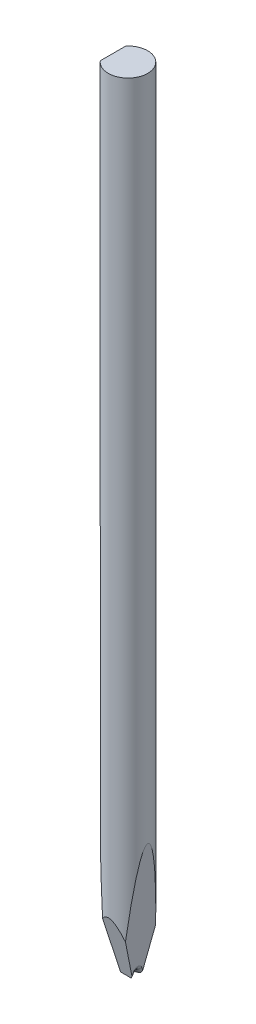
ISO-10303-21;
HEADER;
FILE_DESCRIPTION(('STEP AP214'),'2;1');
FILE_NAME('part.step','',(''),(''),'','','');
FILE_SCHEMA(('AUTOMOTIVE_DESIGN { 1 0 10303 214 1 1 1 1 }'));
ENDSEC;
DATA;
#1=APPLICATION_CONTEXT('core data for automotive mechanical design processes');
#2=APPLICATION_PROTOCOL_DEFINITION('international standard','automotive_design',2000,#1);
#3=PRODUCT_CONTEXT('',#1,'mechanical');
#4=PRODUCT('Part','Part','',(#3));
#5=PRODUCT_RELATED_PRODUCT_CATEGORY('part','',(#4));
#6=PRODUCT_DEFINITION_FORMATION('','',#4);
#7=PRODUCT_DEFINITION_CONTEXT('part definition',#1,'design');
#8=PRODUCT_DEFINITION('design','',#6,#7);
#9=PRODUCT_DEFINITION_SHAPE('','',#8);
#10=(LENGTH_UNIT() NAMED_UNIT(*) SI_UNIT(.MILLI.,.METRE.));
#11=(NAMED_UNIT(*) PLANE_ANGLE_UNIT() SI_UNIT($,.RADIAN.));
#12=(NAMED_UNIT(*) SI_UNIT($,.STERADIAN.) SOLID_ANGLE_UNIT());
#13=UNCERTAINTY_MEASURE_WITH_UNIT(LENGTH_MEASURE(1.E-05),#10,'distance_accuracy_value','');
#14=(GEOMETRIC_REPRESENTATION_CONTEXT(3) GLOBAL_UNCERTAINTY_ASSIGNED_CONTEXT((#13)) GLOBAL_UNIT_ASSIGNED_CONTEXT((#10,
#11,#12)) REPRESENTATION_CONTEXT('',''));
#15=CARTESIAN_POINT('',(0.,0.,0.));
#16=DIRECTION('',(0.,0.,1.));
#17=DIRECTION('',(1.,0.,0.));
#18=AXIS2_PLACEMENT_3D('',#15,#16,#17);
#19=CARTESIAN_POINT('',(0.,0.,0.));
#20=DIRECTION('',(0.,1.,0.));
#21=DIRECTION('',(0.,0.,1.));
#22=AXIS2_PLACEMENT_3D('',#19,#20,#21);
#23=PLANE('',#22);
#24=DIRECTION('',(-1.,0.,0.));
#25=VECTOR('',#24,1.);
#26=CARTESIAN_POINT('',(81.0604131023871,0.,-0.381));
#27=LINE('',#26,#25);
#28=CARTESIAN_POINT('',(0.626289876708139,0.,-0.381));
#29=VERTEX_POINT('',#28);
#30=CARTESIAN_POINT('',(-0.21209,0.,-0.381000000000018));
#31=VERTEX_POINT('',#30);
#32=EDGE_CURVE('E911',#29,#31,#27,.T.);
#33=ORIENTED_EDGE('',*,*,#32,.F.);
#34=CARTESIAN_POINT('',(0.292694122097804,0.,-0.865023897572268));
#35=DIRECTION('',(0.,1.,0.));
#36=DIRECTION('',(0.,0.,-1.));
#37=AXIS2_PLACEMENT_3D('',#34,#35,#36);
#38=ELLIPSE('',#37,0.632556560912635,0.51816);
#39=CARTESIAN_POINT('',(0.292694122097804,-2.34837209755925E-05,-0.232455111808268));
#40=VERTEX_POINT('',#39);
#41=EDGE_CURVE('E565',#29,#40,#38,.F.);
#42=ORIENTED_EDGE('',*,*,#41,.T.);
#43=CARTESIAN_POINT('',(-0.00078755915150692,0.,-0.23241));
#44=DIRECTION('',(1.,0.,0.));
#45=VECTOR('',#44,1.);
#46=LINE('',#43,#45);
#47=CARTESIAN_POINT('',(-0.000787559151506876,-2.34837209756228E-05,-0.232455111808268));
#48=VERTEX_POINT('',#47);
#49=EDGE_CURVE('E554',#48,#40,#46,.T.);
#50=ORIENTED_EDGE('',*,*,#49,.F.);
#51=CARTESIAN_POINT('',(-0.000787559151506812,0.,-0.54874561711595));
#52=DIRECTION('',(0.,1.,0.));
#53=DIRECTION('',(0.,0.,-1.));
#54=AXIS2_PLACEMENT_3D('',#51,#52,#53);
#55=ELLIPSE('',#54,0.316278280456318,0.25908);
#56=CARTESIAN_POINT('',(-0.21209,0.,-0.365736379984119));
#57=VERTEX_POINT('',#56);
#58=EDGE_CURVE('E532',#48,#57,#55,.F.);
#59=ORIENTED_EDGE('',*,*,#58,.T.);
#60=DIRECTION('',(0.,0.,-1.));
#61=VECTOR('',#60,1.);
#62=CARTESIAN_POINT('',(-0.21209,0.,80.8360855398669));
#63=LINE('',#62,#61);
#64=EDGE_CURVE('E696',#57,#31,#63,.T.);
#65=ORIENTED_EDGE('',*,*,#64,.T.);
#66=EDGE_LOOP('',(#33,#42,#50,#59,#65));
#67=FACE_BOUND('',#66,.T.);
#68=ADVANCED_FACE('F413',(#67),#23,.F.);
#69=CARTESIAN_POINT('',(-0.212089999999984,0.,0.381));
#70=VERTEX_POINT('',#69);
#71=CARTESIAN_POINT('',(-0.21209,0.,0.365736379984188));
#72=VERTEX_POINT('',#71);
#73=EDGE_CURVE('E691',#70,#72,#63,.T.);
#74=ORIENTED_EDGE('',*,*,#73,.T.);
#75=CARTESIAN_POINT('',(-0.000787559151506812,0.,0.54874561711595));
#76=DIRECTION('',(0.,1.,0.));
#77=DIRECTION('',(0.,0.,-1.));
#78=AXIS2_PLACEMENT_3D('',#75,#76,#77);
#79=ELLIPSE('',#78,0.316278280456318,0.25908);
#80=CARTESIAN_POINT('',(-0.00078755915150689,-2.34837209739068E-05,0.232455111808265));
#81=VERTEX_POINT('',#80);
#82=EDGE_CURVE('E545',#72,#81,#79,.F.);
#83=ORIENTED_EDGE('',*,*,#82,.T.);
#84=CARTESIAN_POINT('',(-0.00078755915150692,0.,0.232409999999995));
#85=DIRECTION('',(1.,0.,0.));
#86=VECTOR('',#85,1.);
#87=LINE('',#84,#86);
#88=CARTESIAN_POINT('',(0.292694122097804,-2.34837209738792E-05,0.232455111808265));
#89=VERTEX_POINT('',#88);
#90=EDGE_CURVE('E566',#81,#89,#87,.T.);
#91=ORIENTED_EDGE('',*,*,#90,.T.);
#92=CARTESIAN_POINT('',(0.292694122097804,0.,0.865023897572267));
#93=DIRECTION('',(0.,1.,0.));
#94=DIRECTION('',(0.,0.,-1.));
#95=AXIS2_PLACEMENT_3D('',#92,#93,#94);
#96=ELLIPSE('',#95,0.632556560912635,0.51816);
#97=CARTESIAN_POINT('',(0.626289876708125,0.,0.381));
#98=VERTEX_POINT('',#97);
#99=EDGE_CURVE('E681',#89,#98,#96,.F.);
#100=ORIENTED_EDGE('',*,*,#99,.T.);
#101=DIRECTION('',(-1.,0.,0.));
#102=VECTOR('',#101,1.);
#103=CARTESIAN_POINT('',(81.0604131023871,0.,0.381));
#104=LINE('',#103,#102);
#105=EDGE_CURVE('E914',#98,#70,#104,.T.);
#106=ORIENTED_EDGE('',*,*,#105,.T.);
#107=EDGE_LOOP('',(#74,#83,#91,#100,#106));
#108=FACE_BOUND('',#107,.T.);
#109=ADVANCED_FACE('F587',(#108),#23,.F.);
#110=CARTESIAN_POINT('',(81.0604131023871,0.,0.381));
#111=DIRECTION('',(0.,-0.258819045102521,0.965925826289068));
#112=DIRECTION('',(0.,-0.965925826289068,-0.258819045102521));
#113=AXIS2_PLACEMENT_3D('',#110,#111,#112);
#114=PLANE('',#113);
#115=CARTESIAN_POINT('',(0.292694122097804,0.49994374077417,0.514959521601434));
#116=DIRECTION('',(0.,-0.258819045102521,0.965925826289068));
#117=DIRECTION('',(0.,0.965925826289068,0.258819045102521));
#118=AXIS2_PLACEMENT_3D('',#115,#116,#117);
#119=ELLIPSE('',#118,0.676409841040414,0.51816);
#120=CARTESIAN_POINT('',(0.759290824462987,0.215808811131296,0.438825796662151));
#121=VERTEX_POINT('',#120);
#122=EDGE_CURVE('E677',#121,#98,#119,.F.);
#123=ORIENTED_EDGE('',*,*,#122,.F.);
#124=DIRECTION('',(-0.0842074097641778,-0.962495097884607,-0.257899784197096));
#125=VECTOR('',#124,1.);
#126=CARTESIAN_POINT('',(1.30995013484898,6.50987352984572,2.12531535515091));
#127=LINE('',#126,#125);
#128=CARTESIAN_POINT('',(1.0142286579587,3.12976158194,1.21961708838278));
#129=VERTEX_POINT('',#128);
#130=EDGE_CURVE('E922',#129,#121,#127,.T.);
#131=ORIENTED_EDGE('',*,*,#130,.F.);
#132=CARTESIAN_POINT('',(0.,-1.42191135768374,0.));
#133=DIRECTION('',(0.,-0.258819045102521,0.965925826289068));
#134=DIRECTION('',(0.,-0.965925826289068,-0.258819045102521));
#135=AXIS2_PLACEMENT_3D('',#132,#133,#134);
#136=ELLIPSE('',#135,6.12872209373802,1.58623);
#137=CARTESIAN_POINT('',(-0.57090412518167,4.10126421779622,1.47993043510516));
#138=VERTEX_POINT('',#137);
#139=EDGE_CURVE('E907',#129,#138,#136,.T.);
#140=ORIENTED_EDGE('',*,*,#139,.T.);
#141=DIRECTION('',(-0.0842074097641778,0.962495097884607,0.257899784197096));
#142=VECTOR('',#141,1.);
#143=CARTESIAN_POINT('',(0.364204205534888,-6.58707291104188,-1.3840008669986));
#144=LINE('',#143,#142);
#145=EDGE_CURVE('E918',#70,#138,#144,.T.);
#146=ORIENTED_EDGE('',*,*,#145,.F.);
#147=ORIENTED_EDGE('',*,*,#105,.F.);
#148=EDGE_LOOP('',(#123,#131,#140,#146,#147));
#149=FACE_BOUND('',#148,.T.);
#150=ADVANCED_FACE('F602',(#149),#114,.T.);
#151=CARTESIAN_POINT('',(81.0604131023871,0.,-0.381));
#152=DIRECTION('',(0.,-0.258819045102521,-0.965925826289068));
#153=DIRECTION('',(0.,0.965925826289068,-0.258819045102521));
#154=AXIS2_PLACEMENT_3D('',#151,#152,#153);
#155=PLANE('',#154);
#156=CARTESIAN_POINT('',(0.292694122097804,0.499943740774171,-0.514959521601434));
#157=DIRECTION('',(0.,-0.258819045102521,-0.965925826289068));
#158=DIRECTION('',(0.,-0.965925826289068,0.258819045102521));
#159=AXIS2_PLACEMENT_3D('',#156,#157,#158);
#160=ELLIPSE('',#159,0.676409841040414,0.51816);
#161=CARTESIAN_POINT('',(0.759290824462986,0.215808811131297,-0.438825796662152));
#162=VERTEX_POINT('',#161);
#163=EDGE_CURVE('E672',#29,#162,#160,.F.);
#164=ORIENTED_EDGE('',*,*,#163,.F.);
#165=ORIENTED_EDGE('',*,*,#32,.T.);
#166=DIRECTION('',(0.0842074097641778,-0.962495097884607,0.257899784197095));
#167=VECTOR('',#166,1.);
#168=CARTESIAN_POINT('',(0.364204205534874,-6.58707291104188,1.3840008669986));
#169=LINE('',#168,#167);
#170=CARTESIAN_POINT('',(-0.570904125181683,4.1012642177962,-1.47993043510515));
#171=VERTEX_POINT('',#170);
#172=EDGE_CURVE('E886',#171,#31,#169,.T.);
#173=ORIENTED_EDGE('',*,*,#172,.F.);
#174=CARTESIAN_POINT('',(0.,-1.42191135768374,0.));
#175=DIRECTION('',(0.,-0.258819045102521,-0.965925826289068));
#176=DIRECTION('',(0.,-0.965925826289068,0.258819045102521));
#177=AXIS2_PLACEMENT_3D('',#174,#175,#176);
#178=ELLIPSE('',#177,6.12872209373802,1.58623);
#179=CARTESIAN_POINT('',(1.0142286579587,3.12976158194,-1.21961708838278));
#180=VERTEX_POINT('',#179);
#181=EDGE_CURVE('E885',#171,#180,#178,.T.);
#182=ORIENTED_EDGE('',*,*,#181,.T.);
#183=DIRECTION('',(0.0842074097641778,0.962495097884607,-0.257899784197095));
#184=VECTOR('',#183,1.);
#185=CARTESIAN_POINT('',(1.30995013484898,6.50987352984572,-2.12531535515091));
#186=LINE('',#185,#184);
#187=EDGE_CURVE('E877',#162,#180,#186,.T.);
#188=ORIENTED_EDGE('',*,*,#187,.F.);
#189=EDGE_LOOP('',(#164,#165,#173,#182,#188));
#190=FACE_BOUND('',#189,.T.);
#191=ADVANCED_FACE('F599',(#190),#155,.T.);
#192=CARTESIAN_POINT('',(-1.20777,0.261194875288342,-0.0495193793813582));
#193=DIRECTION('',(0.,0.573576436351044,-0.819152044288993));
#194=DIRECTION('',(0.,0.819152044288993,0.573576436351044));
#195=AXIS2_PLACEMENT_3D('',#192,#193,#194);
#196=PLANE('',#195);
#197=DIRECTION('',(0.,-0.819152044288993,-0.573576436351044));
#198=VECTOR('',#197,1.);
#199=CARTESIAN_POINT('',(0.292694122097804,0.261221814706321,-0.0495578528574473));
#200=LINE('',#199,#198);
#201=CARTESIAN_POINT('',(0.292694122097804,0.261208344997329,-0.0495386161194023));
#202=VERTEX_POINT('',#201);
#203=EDGE_CURVE('E417',#202,#40,#200,.T.);
#204=ORIENTED_EDGE('',*,*,#203,.F.);
#205=CARTESIAN_POINT('',(-0.00078755915150692,0.261194875288342,-0.0495193793813582));
#206=DIRECTION('',(1.,0.,0.));
#207=VECTOR('',#206,1.);
#208=LINE('',#205,#207);
#209=CARTESIAN_POINT('',(-0.00078755915150689,0.261208344997329,-0.0495386161194022));
#210=VERTEX_POINT('',#209);
#211=EDGE_CURVE('E557',#210,#202,#208,.T.);
#212=ORIENTED_EDGE('',*,*,#211,.F.);
#213=DIRECTION('',(0.,-0.819152044288993,-0.573576436351044));
#214=VECTOR('',#213,1.);
#215=CARTESIAN_POINT('',(-0.000787559151506859,0.261221814706321,-0.0495578528574472));
#216=LINE('',#215,#214);
#217=EDGE_CURVE('E536',#210,#48,#216,.T.);
#218=ORIENTED_EDGE('',*,*,#217,.T.);
#219=ORIENTED_EDGE('',*,*,#49,.T.);
#220=EDGE_LOOP('',(#204,#212,#218,#219));
#221=FACE_BOUND('',#220,.T.);
#222=ADVANCED_FACE('F553',(#221),#196,.F.);
#223=CARTESIAN_POINT('',(-1.20777,0.,0.23241));
#224=DIRECTION('',(0.,0.573576436351044,0.819152044288993));
#225=DIRECTION('',(0.,-0.819152044288993,0.573576436351044));
#226=AXIS2_PLACEMENT_3D('',#223,#224,#225);
#227=PLANE('',#226);
#228=ORIENTED_EDGE('',*,*,#90,.F.);
#229=DIRECTION('',(0.,0.819152044288993,-0.573576436351044));
#230=VECTOR('',#229,1.);
#231=CARTESIAN_POINT('',(-0.000787559151506859,-0.978870365442467,0.917879745472538));
#232=LINE('',#231,#230);
#233=CARTESIAN_POINT('',(-0.00078755915150689,0.261208344997332,0.0495386161194021));
#234=VERTEX_POINT('',#233);
#235=EDGE_CURVE('E546',#81,#234,#232,.T.);
#236=ORIENTED_EDGE('',*,*,#235,.T.);
#237=CARTESIAN_POINT('',(-0.00078755915150692,0.261194875288344,0.0495193793813572));
#238=DIRECTION('',(1.,0.,0.));
#239=VECTOR('',#238,1.);
#240=LINE('',#237,#239);
#241=CARTESIAN_POINT('',(0.292694122097804,0.261208344997332,0.0495386161194021));
#242=VERTEX_POINT('',#241);
#243=EDGE_CURVE('E684',#234,#242,#240,.T.);
#244=ORIENTED_EDGE('',*,*,#243,.T.);
#245=DIRECTION('',(0.,0.819152044288993,-0.573576436351044));
#246=VECTOR('',#245,1.);
#247=CARTESIAN_POINT('',(0.292694122097804,-0.978870365442467,0.917879745472538));
#248=LINE('',#247,#246);
#249=EDGE_CURVE('E769',#89,#242,#248,.T.);
#250=ORIENTED_EDGE('',*,*,#249,.F.);
#251=EDGE_LOOP('',(#228,#236,#244,#250));
#252=FACE_BOUND('',#251,.T.);
#253=ADVANCED_FACE('F597',(#252),#227,.F.);
#254=CARTESIAN_POINT('',(-1.20777,158.947873488151,-1.02830794998386));
#255=DIRECTION('',(1.,0.,0.));
#256=DIRECTION('',(0.,0.,-1.));
#257=AXIS2_PLACEMENT_3D('',#254,#255,#256);
#258=PLANE('',#257);
#259=DIRECTION('',(0.,0.,-1.));
#260=VECTOR('',#259,1.);
#261=CARTESIAN_POINT('',(-1.20777,11.3806744768134,80.8360855398669));
#262=LINE('',#261,#260);
#263=CARTESIAN_POINT('',(-1.20777,11.3806744768134,1.02830794998386));
#264=VERTEX_POINT('',#263);
#265=CARTESIAN_POINT('',(-1.20777,11.3806744768134,-1.02830794998386));
#266=VERTEX_POINT('',#265);
#267=EDGE_CURVE('E687',#264,#266,#262,.T.);
#268=ORIENTED_EDGE('',*,*,#267,.F.);
#269=DIRECTION('',(0.,-1.,0.));
#270=VECTOR('',#269,1.);
#271=CARTESIAN_POINT('',(-1.20777,158.947873488151,1.02830794998386));
#272=LINE('',#271,#270);
#273=CARTESIAN_POINT('',(-1.20777,63.5,1.02830794998386));
#274=VERTEX_POINT('',#273);
#275=EDGE_CURVE('E897',#274,#264,#272,.T.);
#276=ORIENTED_EDGE('',*,*,#275,.F.);
#277=DIRECTION('',(0.,0.,-1.));
#278=VECTOR('',#277,1.);
#279=CARTESIAN_POINT('',(-1.20777,63.5,0.));
#280=LINE('',#279,#278);
#281=CARTESIAN_POINT('',(-1.20777,63.5,-1.02830794998386));
#282=VERTEX_POINT('',#281);
#283=EDGE_CURVE('E892',#274,#282,#280,.T.);
#284=ORIENTED_EDGE('',*,*,#283,.T.);
#285=DIRECTION('',(0.,-1.,0.));
#286=VECTOR('',#285,1.);
#287=CARTESIAN_POINT('',(-1.20777,158.947873488151,-1.02830794998386));
#288=LINE('',#287,#286);
#289=EDGE_CURVE('E898',#282,#266,#288,.T.);
#290=ORIENTED_EDGE('',*,*,#289,.T.);
#291=EDGE_LOOP('',(#268,#276,#284,#290));
#292=FACE_BOUND('',#291,.T.);
#293=ADVANCED_FACE('F594',(#292),#258,.F.);
#294=CARTESIAN_POINT('',(0.,63.5,0.));
#295=DIRECTION('',(0.,-1.,0.));
#296=DIRECTION('',(0.,0.,-1.));
#297=AXIS2_PLACEMENT_3D('',#294,#295,#296);
#298=CYLINDRICAL_SURFACE('',#297,1.58623);
#299=ORIENTED_EDGE('',*,*,#181,.F.);
#300=CARTESIAN_POINT('',(0.,-2.42419979289266,0.));
#301=DIRECTION('',(0.996194698091746,0.0871557427476583,0.));
#302=DIRECTION('',(0.0871557427476583,-0.996194698091746,0.));
#303=AXIS2_PLACEMENT_3D('',#300,#301,#302);
#304=ELLIPSE('',#303,18.1999481616789,1.58623);
#305=EDGE_CURVE('E921',#171,#266,#304,.T.);
#306=ORIENTED_EDGE('',*,*,#305,.T.);
#307=ORIENTED_EDGE('',*,*,#289,.F.);
#308=CARTESIAN_POINT('',(0.,63.5,0.));
#309=DIRECTION('',(0.,1.,0.));
#310=DIRECTION('',(0.,0.,1.));
#311=AXIS2_PLACEMENT_3D('',#308,#309,#310);
#312=CIRCLE('',#311,1.58623);
#313=EDGE_CURVE('E887',#274,#282,#312,.T.);
#314=ORIENTED_EDGE('',*,*,#313,.F.);
#315=ORIENTED_EDGE('',*,*,#275,.T.);
#316=EDGE_CURVE('E917',#264,#138,#304,.T.);
#317=ORIENTED_EDGE('',*,*,#316,.T.);
#318=ORIENTED_EDGE('',*,*,#139,.F.);
#319=CARTESIAN_POINT('',(0.,-8.46292502548751,0.));
#320=DIRECTION('',(-0.996194698091746,0.0871557427476583,0.));
#321=DIRECTION('',(-0.0871557427476583,-0.996194698091746,0.));
#322=AXIS2_PLACEMENT_3D('',#319,#320,#321);
#323=ELLIPSE('',#322,18.1999481616789,1.58623);
#324=EDGE_CURVE('E690',#129,#180,#323,.T.);
#325=ORIENTED_EDGE('',*,*,#324,.T.);
#326=EDGE_LOOP('',(#299,#306,#307,#314,#315,#317,#318,#325));
#327=FACE_BOUND('',#326,.T.);
#328=ADVANCED_FACE('F415',(#327),#298,.T.);
#329=CARTESIAN_POINT('',(0.,63.5,0.));
#330=DIRECTION('',(0.,1.,0.));
#331=DIRECTION('',(0.,0.,1.));
#332=AXIS2_PLACEMENT_3D('',#329,#330,#331);
#333=PLANE('',#332);
#334=ORIENTED_EDGE('',*,*,#283,.F.);
#335=ORIENTED_EDGE('',*,*,#313,.T.);
#336=EDGE_LOOP('',(#334,#335));
#337=FACE_BOUND('',#336,.T.);
#338=ADVANCED_FACE('F588',(#337),#333,.T.);
#339=CARTESIAN_POINT('',(0.74041,0.,80.8360855398669));
#340=DIRECTION('',(-0.996194698091746,0.0871557427476583,0.));
#341=DIRECTION('',(-0.0871557427476583,-0.996194698091746,0.));
#342=AXIS2_PLACEMENT_3D('',#339,#340,#341);
#343=PLANE('',#342);
#344=ORIENTED_EDGE('',*,*,#130,.T.);
#345=CARTESIAN_POINT('',(0.292694122097804,-5.1174159011988,4.44827708774589));
#346=DIRECTION('',(-0.996194698091746,0.0871557427476583,0.));
#347=DIRECTION('',(0.0713040831581058,0.815009399897592,-0.575043829463068));
#348=AXIS2_PLACEMENT_3D('',#345,#346,#347);
#349=ELLIPSE('',#348,7.25777259157866,0.51816);
#350=CARTESIAN_POINT('',(0.780496618244102,0.458192143170916,0.330860634841499));
#351=VERTEX_POINT('',#350);
#352=EDGE_CURVE('E53',#121,#351,#349,.F.);
#353=ORIENTED_EDGE('',*,*,#352,.T.);
#354=CARTESIAN_POINT('',(0.762787134236256,0.255771814706321,0.359520672850719));
#355=CARTESIAN_POINT('',(0.764815604530593,0.278957336265184,0.362039384910398));
#356=CARTESIAN_POINT('',(0.766860872010512,0.3023348505338,0.362520963411102));
#357=CARTESIAN_POINT('',(0.770926160729569,0.348801313218445,0.359589885272083));
#358=CARTESIAN_POINT('',(0.772946225590665,0.371890760235739,0.356185316892519));
#359=CARTESIAN_POINT('',(0.776927290673282,0.417394542350755,0.345628154121357));
#360=CARTESIAN_POINT('',(0.778887676094542,0.439801850249324,0.338445269741209));
#361=CARTESIAN_POINT('',(0.782683753307511,0.483191211338879,0.320587439402001));
#362=CARTESIAN_POINT('',(0.784519416627638,0.504172939098192,0.309911699306258));
#363=CARTESIAN_POINT('',(0.788108771740648,0.545199455773081,0.284769986725264));
#364=CARTESIAN_POINT('',(0.789853841744386,0.565145697187785,0.270141869960245));
#365=CARTESIAN_POINT('',(0.793111810196539,0.602384446996637,0.237743110938489));
#366=CARTESIAN_POINT('',(0.794624370672428,0.619673092347135,0.219967973426176));
#367=CARTESIAN_POINT('',(0.797116648865417,0.648159962446035,0.185071282745096));
#368=CARTESIAN_POINT('',(0.798143293234103,0.65989456127645,0.168389709285848));
#369=CARTESIAN_POINT('',(0.799952698211834,0.68057615480879,0.133456778161758));
#370=CARTESIAN_POINT('',(0.800736733003094,0.689537713480086,0.115214287222648));
#371=CARTESIAN_POINT('',(0.801898437072639,0.702816051755315,0.080154694197803));
#372=CARTESIAN_POINT('',(0.802319376552824,0.70762741203012,0.0635332054866252));
#373=CARTESIAN_POINT('',(0.802880095891901,0.714036463402946,0.0294915065507647));
#374=CARTESIAN_POINT('',(0.803016475911382,0.715595294158662,0.0120641530259947));
#375=CARTESIAN_POINT('',(0.802976830554627,0.715142145657389,-0.00545000000302808));
#376=B_SPLINE_CURVE_WITH_KNOTS('',3,(#354,#355,#356,#357,#358,#359,#360,#361,#362,#363,#364,
#365,#366,#367,#368,#369,#370,#371,#372,#373,#374,#375),.UNSPECIFIED.,.F.,.F.,(4,2,2,2,2,2,2,2,
2,2,4),(0.,0.0701038971169503,0.140062152214192,0.210589993347197,0.281133880866584,
0.355187413221324,0.429347591063818,0.49039738321922,0.551120876358733,0.602751381949611,
0.654995303000235),.UNSPECIFIED.);
#377=CARTESIAN_POINT('',(0.802982107398609,0.715202460260103,0.));
#378=VERTEX_POINT('',#377);
#379=EDGE_CURVE('E867',#351,#378,#376,.T.);
#380=ORIENTED_EDGE('',*,*,#379,.T.);
#381=CARTESIAN_POINT('',(0.80297683055532,0.715142145665312,0.00545));
#382=CARTESIAN_POINT('',(0.803012282180302,0.715547359593074,-0.0103947444104316));
#383=CARTESIAN_POINT('',(0.802903848671188,0.714307958912526,-0.0261867335513459));
#384=CARTESIAN_POINT('',(0.802445887326931,0.709073436795034,-0.0571590759519481));
#385=CARTESIAN_POINT('',(0.802098711996862,0.70510520461411,-0.0723438808365805));
#386=CARTESIAN_POINT('',(0.801083757676229,0.693504223644368,-0.106076204929784));
#387=CARTESIAN_POINT('',(0.800353269299049,0.685154703286635,-0.124368274740353));
#388=CARTESIAN_POINT('',(0.798647393200836,0.665656450262027,-0.159456860358856));
#389=CARTESIAN_POINT('',(0.797670849776199,0.654494507842516,-0.176245797008791));
#390=CARTESIAN_POINT('',(0.795495005123126,0.629624489655208,-0.208401383364559));
#391=CARTESIAN_POINT('',(0.794291216129509,0.615865118496672,-0.223727895694972));
#392=CARTESIAN_POINT('',(0.791711799429598,0.58638225070608,-0.252282817944771));
#393=CARTESIAN_POINT('',(0.790336426883816,0.57066167057201,-0.265514278444488));
#394=CARTESIAN_POINT('',(0.787155552564678,0.534304110735746,-0.292061478155753));
#395=CARTESIAN_POINT('',(0.785318590459709,0.513307537797767,-0.304885030024186));
#396=CARTESIAN_POINT('',(0.781482501537721,0.469460840781393,-0.326890465991836));
#397=CARTESIAN_POINT('',(0.77948314298343,0.446608067933873,-0.336067031905535));
#398=CARTESIAN_POINT('',(0.775346831790213,0.399329814654908,-0.350529941708619));
#399=CARTESIAN_POINT('',(0.773208255299714,0.374885773515052,-0.355755339920927));
#400=CARTESIAN_POINT('',(0.768888289986707,0.325508344041269,-0.361793717003572));
#401=CARTESIAN_POINT('',(0.766707043853634,0.300576586655044,-0.362619491437409));
#402=CARTESIAN_POINT('',(0.763954502693067,0.269114897224264,-0.360794487046333));
#403=CARTESIAN_POINT('',(0.763369912104467,0.262432996220863,-0.360240934785802));
#404=CARTESIAN_POINT('',(0.762787134236258,0.25577181470634,-0.359520672850354));
#405=B_SPLINE_CURVE_WITH_KNOTS('',3,(#381,#382,#383,#384,#385,#386,#387,#388,#389,#390,#391,
#392,#393,#394,#395,#396,#397,#398,#399,#400,#401,#402,#403,#404),.UNSPECIFIED.,.F.,.F.,(4,2,2,
2,2,2,2,2,2,2,2,4),(0.,0.0473264286386898,0.0941930733156189,0.154241604400489,
0.214577615531731,0.276261103648507,0.337853932395287,0.411523857700982,0.485300820783467,
0.560193780557392,0.634868807417224,0.655050862304582),.UNSPECIFIED.);
#406=CARTESIAN_POINT('',(0.780496618244065,0.458192143170855,-0.330860634841412));
#407=VERTEX_POINT('',#406);
#408=EDGE_CURVE('E859',#378,#407,#405,.T.);
#409=ORIENTED_EDGE('',*,*,#408,.T.);
#410=CARTESIAN_POINT('',(0.292694122097804,-5.1174159011988,-4.44827708774589));
#411=DIRECTION('',(-0.996194698091746,0.0871557427476583,0.));
#412=DIRECTION('',(-0.0713040831581058,-0.815009399897592,-0.575043829463068));
#413=AXIS2_PLACEMENT_3D('',#410,#411,#412);
#414=ELLIPSE('',#413,7.25777259157866,0.51816);
#415=EDGE_CURVE('E423',#407,#162,#414,.F.);
#416=ORIENTED_EDGE('',*,*,#415,.T.);
#417=ORIENTED_EDGE('',*,*,#187,.T.);
#418=ORIENTED_EDGE('',*,*,#324,.F.);
#419=EDGE_LOOP('',(#344,#353,#380,#409,#416,#417,#418));
#420=FACE_BOUND('',#419,.T.);
#421=CARTESIAN_POINT('',(0.810854122097809,0.80518000000006,0.));
#422=VERTEX_POINT('',#421);
#423=VERTEX_LOOP('',#422);
#424=FACE_BOUND('',#423,.T.);
#425=ADVANCED_FACE('F592',(#420,#424),#343,.F.);
#426=CARTESIAN_POINT('',(-0.21209,0.,80.8360855398669));
#427=DIRECTION('',(0.996194698091746,0.0871557427476583,0.));
#428=DIRECTION('',(-0.0871557427476583,0.996194698091746,0.));
#429=AXIS2_PLACEMENT_3D('',#426,#427,#428);
#430=PLANE('',#429);
#431=CARTESIAN_POINT('',(-0.259867559151507,0.546099999999999,-1.7379376051545E-11));
#432=VERTEX_POINT('',#431);
#433=VERTEX_LOOP('',#432);
#434=FACE_BOUND('',#433,.T.);
#435=CARTESIAN_POINT('',(-0.255922162904575,0.501003914542451,-0.00545000000000001));
#436=CARTESIAN_POINT('',(-0.255955872266,0.50138921430663,0.00343066359325977));
#437=CARTESIAN_POINT('',(-0.255908305073318,0.50084551880638,0.0122968820394661));
#438=CARTESIAN_POINT('',(-0.255677061063843,0.498202387683378,0.0297091638289666));
#439=CARTESIAN_POINT('',(-0.255494754512329,0.496118614264443,0.0382575466902675));
#440=CARTESIAN_POINT('',(-0.254951111532747,0.489904746573781,0.0573535364515902));
#441=CARTESIAN_POINT('',(-0.254553127052776,0.485355763152033,0.0677595106397102));
#442=CARTESIAN_POINT('',(-0.253618219367445,0.474669719410447,0.0877587017695777));
#443=CARTESIAN_POINT('',(-0.253080610479335,0.468524821700919,0.0973475883979923));
#444=CARTESIAN_POINT('',(-0.251877947468495,0.454778320584419,0.11576456193929));
#445=CARTESIAN_POINT('',(-0.251210163746611,0.44714551771635,0.124569099225409));
#446=CARTESIAN_POINT('',(-0.249775730084918,0.43074986593836,0.141011633223129));
#447=CARTESIAN_POINT('',(-0.249009231698123,0.421988749287306,0.148651379723932));
#448=CARTESIAN_POINT('',(-0.247231507252528,0.40166926589426,0.164038926805721));
#449=CARTESIAN_POINT('',(-0.246201866561304,0.389900418940517,0.171509028626686));
#450=CARTESIAN_POINT('',(-0.244048242596826,0.365284384386063,0.18439563915613));
#451=CARTESIAN_POINT('',(-0.242924185054547,0.352436347886497,0.189810512376372));
#452=CARTESIAN_POINT('',(-0.240594094676945,0.325803293000342,0.19844742601652));
#453=CARTESIAN_POINT('',(-0.239387064917989,0.312006879724485,0.201634358493114));
#454=CARTESIAN_POINT('',(-0.236941322074838,0.284051911108171,0.205533476624436));
#455=CARTESIAN_POINT('',(-0.235702562488131,0.269892824241557,0.206241792676509));
#456=CARTESIAN_POINT('',(-0.234467134234814,0.255771814689836,0.205632675055994));
#457=B_SPLINE_CURVE_WITH_KNOTS('',3,(#435,#436,#437,#438,#439,#440,#441,#442,#443,#444,#445,
#446,#447,#448,#449,#450,#451,#452,#453,#454,#455,#456),.UNSPECIFIED.,.F.,.F.,(4,2,2,2,2,2,2,2,
2,2,4),(0.,0.0265389037966937,0.0528115642143606,0.0867253407003101,0.120808921967882,
0.15570400226623,0.190546134208457,0.232282048101743,0.274051104875035,0.316464363207992,
0.358943807422877),.UNSPECIFIED.);
#458=CARTESIAN_POINT('',(-0.255931551801901,0.501111230130003,0.));
#459=VERTEX_POINT('',#458);
#460=CARTESIAN_POINT('',(-0.243381274119807,0.357660899809443,0.187287139990221));
#461=VERTEX_POINT('',#460);
#462=EDGE_CURVE('E617',#459,#461,#457,.T.);
#463=ORIENTED_EDGE('',*,*,#462,.T.);
#464=CARTESIAN_POINT('',(-0.000787559151506812,-2.41519795059941,2.23988542839429));
#465=DIRECTION('',(0.996194698091746,0.0871557427476583,0.));
#466=DIRECTION('',(-0.0713040831581058,0.815009399897592,-0.575043829463068));
#467=AXIS2_PLACEMENT_3D('',#464,#465,#466);
#468=ELLIPSE('',#467,3.62888629578933,0.25908);
#469=EDGE_CURVE('E935',#461,#72,#468,.F.);
#470=ORIENTED_EDGE('',*,*,#469,.T.);
#471=ORIENTED_EDGE('',*,*,#73,.F.);
#472=ORIENTED_EDGE('',*,*,#145,.T.);
#473=ORIENTED_EDGE('',*,*,#316,.F.);
#474=ORIENTED_EDGE('',*,*,#267,.T.);
#475=ORIENTED_EDGE('',*,*,#305,.F.);
#476=ORIENTED_EDGE('',*,*,#172,.T.);
#477=ORIENTED_EDGE('',*,*,#64,.F.);
#478=CARTESIAN_POINT('',(-0.000787559151506812,-2.41519795059941,-2.23988542839429));
#479=DIRECTION('',(0.996194698091746,0.0871557427476583,0.));
#480=DIRECTION('',(0.0713040831581058,-0.815009399897592,-0.575043829463068));
#481=AXIS2_PLACEMENT_3D('',#478,#479,#480);
#482=ELLIPSE('',#481,3.62888629578933,0.25908);
#483=CARTESIAN_POINT('',(-0.243381274117761,0.357660899792553,-0.187287139995384));
#484=VERTEX_POINT('',#483);
#485=EDGE_CURVE('E540',#57,#484,#482,.F.);
#486=ORIENTED_EDGE('',*,*,#485,.T.);
#487=CARTESIAN_POINT('',(-0.234467134236256,0.255771814706321,-0.205632675107196));
#488=CARTESIAN_POINT('',(-0.235630967594588,0.269074490863756,-0.206204612273257));
#489=CARTESIAN_POINT('',(-0.236797845834611,0.282411970178173,-0.205609707980176));
#490=CARTESIAN_POINT('',(-0.239104566971446,0.308777913420078,-0.20221024249972));
#491=CARTESIAN_POINT('',(-0.240244461729022,0.321806970118818,-0.199410347462441));
#492=CARTESIAN_POINT('',(-0.24247755923303,0.347331391386797,-0.191697658344837));
#493=CARTESIAN_POINT('',(-0.243570350287652,0.359822050297115,-0.186769260052997));
#494=CARTESIAN_POINT('',(-0.245673336169078,0.383859288913777,-0.174968697517735));
#495=CARTESIAN_POINT('',(-0.246683502129491,0.395405538675769,-0.168095857660312));
#496=CARTESIAN_POINT('',(-0.248639600667621,0.417763847275955,-0.152247777816822));
#497=CARTESIAN_POINT('',(-0.249580530935403,0.428518729449947,-0.143191216974891));
#498=CARTESIAN_POINT('',(-0.251318570375735,0.448384611157201,-0.123381683071966));
#499=CARTESIAN_POINT('',(-0.252115514171353,0.457493720423486,-0.112626785597278));
#500=CARTESIAN_POINT('',(-0.253364643303122,0.471771331732507,-0.092346505352809));
#501=CARTESIAN_POINT('',(-0.253853880960757,0.477363343747752,-0.083120080661103));
#502=CARTESIAN_POINT('',(-0.254701724438708,0.487054239045289,-0.0639500181513562));
#503=CARTESIAN_POINT('',(-0.255061025754488,0.491161071877104,-0.0540105506875586));
#504=CARTESIAN_POINT('',(-0.255547956797893,0.496726719171057,-0.035852178536189));
#505=CARTESIAN_POINT('',(-0.255709714598441,0.498575619291701,-0.0277570528630296));
#506=CARTESIAN_POINT('',(-0.255913203069715,0.500901503161377,-0.0112950564918258));
#507=CARTESIAN_POINT('',(-0.255953736285239,0.501364799934815,-0.00292629497597485));
#508=CARTESIAN_POINT('',(-0.255922162904548,0.501003914542139,0.00545000000009645));
#509=B_SPLINE_CURVE_WITH_KNOTS('',3,(#487,#488,#489,#490,#491,#492,#493,#494,#495,#496,#497,
#498,#499,#500,#501,#502,#503,#504,#505,#506,#507,#508),.UNSPECIFIED.,.F.,.F.,(4,2,2,2,2,2,2,2,
2,2,4),(0.,0.0400263905493319,0.0799683050505352,0.120208143870167,0.160461981597388,
0.202544376002017,0.244674801433988,0.276971454939742,0.309092585636325,0.333897254732284,
0.358946147918645),.UNSPECIFIED.);
#510=EDGE_CURVE('E625',#484,#459,#509,.T.);
#511=ORIENTED_EDGE('',*,*,#510,.T.);
#512=EDGE_LOOP('',(#463,#470,#471,#472,#473,#474,#475,#476,#477,#486,#511));
#513=FACE_BOUND('',#512,.T.);
#514=ADVANCED_FACE('F607',(#434,#513),#430,.F.);
#515=CARTESIAN_POINT('',(-1.20777,0.226521032558049,0.));
#516=DIRECTION('',(1.,0.,0.));
#517=DIRECTION('',(0.,0.,-1.));
#518=AXIS2_PLACEMENT_3D('',#515,#516,#517);
#519=CYLINDRICAL_SURFACE('',#518,0.060452);
#520=CARTESIAN_POINT('',(-0.000787559151506859,0.226521032558049,0.));
#521=DIRECTION('',(-1.,0.,0.));
#522=DIRECTION('',(0.,0.573576436351043,0.819152044288994));
#523=AXIS2_PLACEMENT_3D('',#520,#521,#522);
#524=CIRCLE('',#523,0.0604989674419507);
#525=CARTESIAN_POINT('',(-0.00078755915150689,0.286996516279025,0.));
#526=VERTEX_POINT('',#525);
#527=EDGE_CURVE('E775',#234,#526,#524,.T.);
#528=ORIENTED_EDGE('',*,*,#527,.T.);
#529=CARTESIAN_POINT('',(-0.000787559151506859,0.226521032558049,0.));
#530=DIRECTION('',(-1.,0.,0.));
#531=DIRECTION('',(0.,1.,0.));
#532=AXIS2_PLACEMENT_3D('',#529,#530,#531);
#533=CIRCLE('',#532,0.0604989674419507);
#534=EDGE_CURVE('E663',#526,#210,#533,.T.);
#535=ORIENTED_EDGE('',*,*,#534,.T.);
#536=ORIENTED_EDGE('',*,*,#211,.T.);
#537=CARTESIAN_POINT('',(0.292694122097804,0.226521032558049,0.));
#538=DIRECTION('',(-1.,0.,0.));
#539=DIRECTION('',(0.,1.,0.));
#540=AXIS2_PLACEMENT_3D('',#537,#538,#539);
#541=CIRCLE('',#540,0.0604989674419508);
#542=CARTESIAN_POINT('',(0.292694122097804,0.286996516279025,0.));
#543=VERTEX_POINT('',#542);
#544=EDGE_CURVE('E750',#543,#202,#541,.T.);
#545=ORIENTED_EDGE('',*,*,#544,.F.);
#546=CARTESIAN_POINT('',(0.292694122097804,0.226521032558049,0.));
#547=DIRECTION('',(-1.,0.,0.));
#548=DIRECTION('',(0.,0.573576436351043,0.819152044288994));
#549=AXIS2_PLACEMENT_3D('',#546,#547,#548);
#550=CIRCLE('',#549,0.0604989674419508);
#551=EDGE_CURVE('E773',#242,#543,#550,.T.);
#552=ORIENTED_EDGE('',*,*,#551,.F.);
#553=ORIENTED_EDGE('',*,*,#243,.F.);
#554=EDGE_LOOP('',(#528,#535,#536,#545,#552,#553));
#555=FACE_BOUND('',#554,.T.);
#556=ADVANCED_FACE('F611',(#555),#519,.F.);
#557=CARTESIAN_POINT('',(-0.000787559151506812,0.226521032558049,0.));
#558=DIRECTION('',(-1.,0.,0.));
#559=DIRECTION('',(0.,0.,1.));
#560=AXIS2_PLACEMENT_3D('',#557,#558,#559);
#561=TOROIDAL_SURFACE('',#560,0.319578967441951,0.25908);
#562=ORIENTED_EDGE('',*,*,#462,.F.);
#563=CARTESIAN_POINT('',(-0.000787559151506812,0.5461,0.));
#564=DIRECTION('',(0.,0.,1.));
#565=DIRECTION('',(1.,0.,0.));
#566=AXIS2_PLACEMENT_3D('',#563,#564,#565);
#567=CIRCLE('',#566,0.25908);
#568=EDGE_CURVE('E664',#459,#526,#567,.T.);
#569=ORIENTED_EDGE('',*,*,#568,.T.);
#570=ORIENTED_EDGE('',*,*,#527,.F.);
#571=CARTESIAN_POINT('',(-0.000787559151506812,0.40982399783615,0.26178376449184));
#572=DIRECTION('',(0.,-0.819152044288993,0.573576436351044));
#573=DIRECTION('',(1.,0.,0.));
#574=AXIS2_PLACEMENT_3D('',#571,#572,#573);
#575=CIRCLE('',#574,0.25908);
#576=EDGE_CURVE('E798',#461,#234,#575,.T.);
#577=ORIENTED_EDGE('',*,*,#576,.F.);
#578=EDGE_LOOP('',(#562,#569,#570,#577));
#579=FACE_BOUND('',#578,.T.);
#580=ADVANCED_FACE('F638',(#579),#561,.T.);
#581=CARTESIAN_POINT('',(-0.000787559151506812,0.226521032558049,0.));
#582=DIRECTION('',(-1.,0.,0.));
#583=DIRECTION('',(0.,0.,1.));
#584=AXIS2_PLACEMENT_3D('',#581,#582,#583);
#585=TOROIDAL_SURFACE('',#584,0.319578967441951,0.25908);
#586=ORIENTED_EDGE('',*,*,#510,.F.);
#587=CARTESIAN_POINT('',(-0.000787559151506812,0.40982399783615,-0.26178376449184));
#588=DIRECTION('',(0.,0.819152044288993,0.573576436351044));
#589=DIRECTION('',(1.,0.,0.));
#590=AXIS2_PLACEMENT_3D('',#587,#588,#589);
#591=CIRCLE('',#590,0.25908);
#592=EDGE_CURVE('E661',#484,#210,#591,.T.);
#593=ORIENTED_EDGE('',*,*,#592,.T.);
#594=ORIENTED_EDGE('',*,*,#534,.F.);
#595=ORIENTED_EDGE('',*,*,#568,.F.);
#596=EDGE_LOOP('',(#586,#593,#594,#595));
#597=FACE_BOUND('',#596,.T.);
#598=ADVANCED_FACE('F634',(#597),#585,.T.);
#599=CARTESIAN_POINT('',(-0.000787559151506812,0.40982399783615,-0.26178376449184));
#600=DIRECTION('',(0.,-0.819152044288993,-0.573576436351044));
#601=DIRECTION('',(0.,0.573576436351044,-0.819152044288993));
#602=AXIS2_PLACEMENT_3D('',#599,#600,#601);
#603=CYLINDRICAL_SURFACE('',#602,0.25908);
#604=ORIENTED_EDGE('',*,*,#58,.F.);
#605=ORIENTED_EDGE('',*,*,#217,.F.);
#606=ORIENTED_EDGE('',*,*,#592,.F.);
#607=ORIENTED_EDGE('',*,*,#485,.F.);
#608=EDGE_LOOP('',(#604,#605,#606,#607));
#609=FACE_BOUND('',#608,.T.);
#610=ADVANCED_FACE('F534',(#609),#603,.T.);
#611=CARTESIAN_POINT('',(-0.000787559151506812,-0.830268182312638,1.13010565710693));
#612=DIRECTION('',(0.,0.819152044288993,-0.573576436351044));
#613=DIRECTION('',(0.,0.573576436351044,0.819152044288993));
#614=AXIS2_PLACEMENT_3D('',#611,#612,#613);
#615=CYLINDRICAL_SURFACE('',#614,0.25908);
#616=ORIENTED_EDGE('',*,*,#82,.F.);
#617=ORIENTED_EDGE('',*,*,#469,.F.);
#618=ORIENTED_EDGE('',*,*,#576,.T.);
#619=ORIENTED_EDGE('',*,*,#235,.F.);
#620=EDGE_LOOP('',(#616,#617,#618,#619));
#621=FACE_BOUND('',#620,.T.);
#622=ADVANCED_FACE('F826',(#621),#615,.T.);
#623=CARTESIAN_POINT('',(0.292694122097804,-0.681665999182809,1.34233156874132));
#624=DIRECTION('',(0.,0.819152044288993,-0.573576436351044));
#625=DIRECTION('',(0.,0.573576436351044,0.819152044288993));
#626=AXIS2_PLACEMENT_3D('',#623,#624,#625);
#627=CYLINDRICAL_SURFACE('',#626,0.51816);
#628=ORIENTED_EDGE('',*,*,#99,.F.);
#629=ORIENTED_EDGE('',*,*,#249,.T.);
#630=CARTESIAN_POINT('',(0.292694122097804,0.558426180965978,0.474009676126232));
#631=DIRECTION('',(0.,-0.819152044288993,0.573576436351044));
#632=DIRECTION('',(1.,0.,0.));
#633=AXIS2_PLACEMENT_3D('',#630,#631,#632);
#634=CIRCLE('',#633,0.51816);
#635=EDGE_CURVE('E794',#242,#351,#634,.T.);
#636=ORIENTED_EDGE('',*,*,#635,.T.);
#637=ORIENTED_EDGE('',*,*,#352,.F.);
#638=ORIENTED_EDGE('',*,*,#122,.T.);
#639=EDGE_LOOP('',(#628,#629,#636,#637,#638));
#640=FACE_BOUND('',#639,.T.);
#641=ADVANCED_FACE('F815',(#640),#627,.T.);
#642=CARTESIAN_POINT('',(0.292694122097804,0.558426180965978,-0.474009676126232));
#643=DIRECTION('',(0.,-0.819152044288993,-0.573576436351044));
#644=DIRECTION('',(0.,0.573576436351044,-0.819152044288993));
#645=AXIS2_PLACEMENT_3D('',#642,#643,#644);
#646=CYLINDRICAL_SURFACE('',#645,0.51816);
#647=ORIENTED_EDGE('',*,*,#41,.F.);
#648=ORIENTED_EDGE('',*,*,#163,.T.);
#649=ORIENTED_EDGE('',*,*,#415,.F.);
#650=CARTESIAN_POINT('',(0.292694122097804,0.558426180965978,-0.474009676126232));
#651=DIRECTION('',(0.,0.819152044288993,0.573576436351044));
#652=DIRECTION('',(1.,0.,0.));
#653=AXIS2_PLACEMENT_3D('',#650,#651,#652);
#654=CIRCLE('',#653,0.51816);
#655=EDGE_CURVE('E559',#202,#407,#654,.T.);
#656=ORIENTED_EDGE('',*,*,#655,.F.);
#657=ORIENTED_EDGE('',*,*,#203,.T.);
#658=EDGE_LOOP('',(#647,#648,#649,#656,#657));
#659=FACE_BOUND('',#658,.T.);
#660=ADVANCED_FACE('F825',(#659),#646,.T.);
#661=CARTESIAN_POINT('',(0.292694122097804,0.226521032558049,0.));
#662=DIRECTION('',(-1.,0.,0.));
#663=DIRECTION('',(0.,0.,1.));
#664=AXIS2_PLACEMENT_3D('',#661,#662,#663);
#665=TOROIDAL_SURFACE('',#664,0.578658967441951,0.51816);
#666=ORIENTED_EDGE('',*,*,#408,.F.);
#667=CARTESIAN_POINT('',(0.292694122097804,0.80518,0.));
#668=DIRECTION('',(0.,0.,1.));
#669=DIRECTION('',(1.,0.,0.));
#670=AXIS2_PLACEMENT_3D('',#667,#668,#669);
#671=CIRCLE('',#670,0.51816);
#672=EDGE_CURVE('E431',#543,#378,#671,.T.);
#673=ORIENTED_EDGE('',*,*,#672,.F.);
#674=ORIENTED_EDGE('',*,*,#544,.T.);
#675=ORIENTED_EDGE('',*,*,#655,.T.);
#676=EDGE_LOOP('',(#666,#673,#674,#675));
#677=FACE_BOUND('',#676,.T.);
#678=ADVANCED_FACE('F853',(#677),#665,.T.);
#679=CARTESIAN_POINT('',(0.292694122097804,0.226521032558049,0.));
#680=DIRECTION('',(-1.,0.,0.));
#681=DIRECTION('',(0.,0.,1.));
#682=AXIS2_PLACEMENT_3D('',#679,#680,#681);
#683=TOROIDAL_SURFACE('',#682,0.578658967441951,0.51816);
#684=ORIENTED_EDGE('',*,*,#379,.F.);
#685=ORIENTED_EDGE('',*,*,#635,.F.);
#686=ORIENTED_EDGE('',*,*,#551,.T.);
#687=ORIENTED_EDGE('',*,*,#672,.T.);
#688=EDGE_LOOP('',(#684,#685,#686,#687));
#689=FACE_BOUND('',#688,.T.);
#690=ADVANCED_FACE('F641',(#689),#683,.T.);
#691=CLOSED_SHELL('',(#68,#109,#150,#191,#222,#253,#293,#328,#338,#425,#514,#556,#580,#598,#610,
#622,#641,#660,#678,#690));
#692=MANIFOLD_SOLID_BREP('B6',#691);
#693=ADVANCED_BREP_SHAPE_REPRESENTATION('',(#18,#692),#14);
#694=SHAPE_DEFINITION_REPRESENTATION(#9,#693);
ENDSEC;
END-ISO-10303-21;
